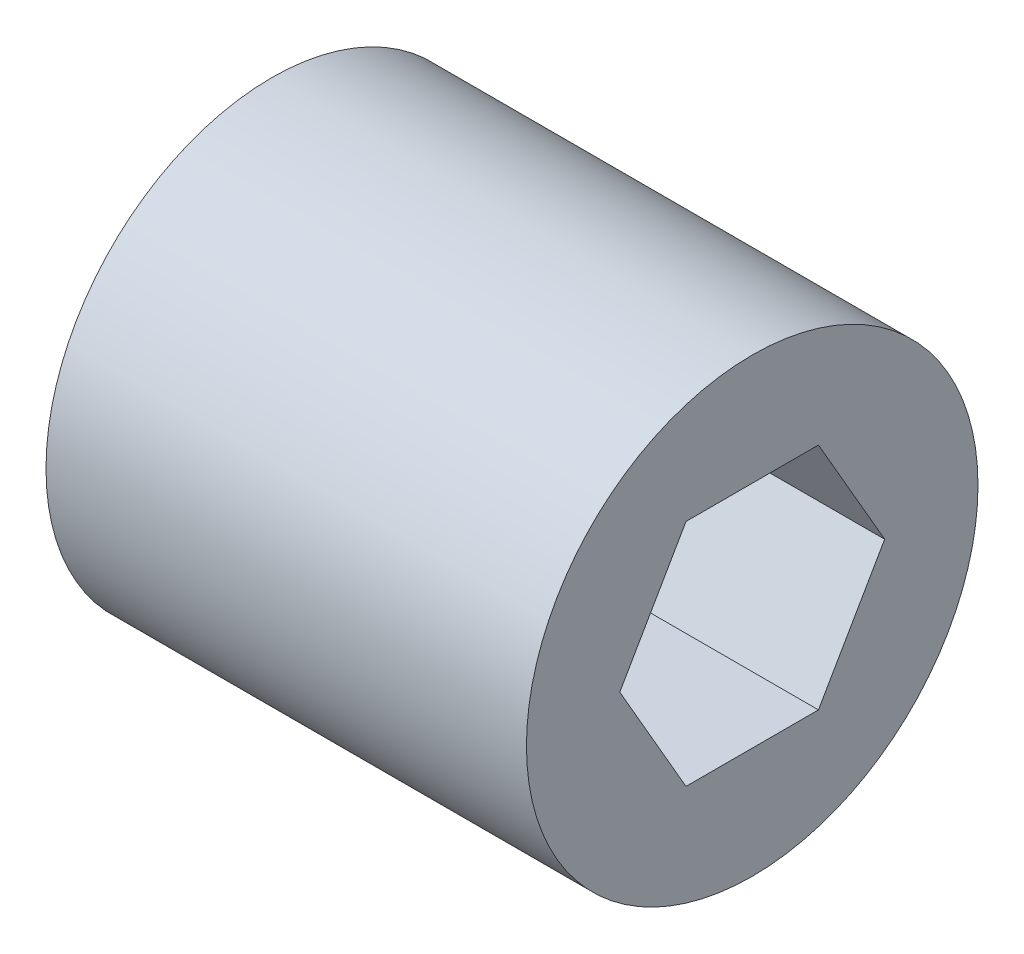
ISO-10303-21;
HEADER;
FILE_DESCRIPTION(('STEP AP214'),'2;1');
FILE_NAME('part.step','',(''),(''),'','','');
FILE_SCHEMA(('AUTOMOTIVE_DESIGN { 1 0 10303 214 1 1 1 1 }'));
ENDSEC;
DATA;
#1=APPLICATION_CONTEXT('core data for automotive mechanical design processes');
#2=APPLICATION_PROTOCOL_DEFINITION('international standard','automotive_design',2000,#1);
#3=PRODUCT_CONTEXT('',#1,'mechanical');
#4=PRODUCT('Part','Part','',(#3));
#5=PRODUCT_RELATED_PRODUCT_CATEGORY('part','',(#4));
#6=PRODUCT_DEFINITION_FORMATION('','',#4);
#7=PRODUCT_DEFINITION_CONTEXT('part definition',#1,'design');
#8=PRODUCT_DEFINITION('design','',#6,#7);
#9=PRODUCT_DEFINITION_SHAPE('','',#8);
#10=(LENGTH_UNIT() NAMED_UNIT(*) SI_UNIT(.MILLI.,.METRE.));
#11=(NAMED_UNIT(*) PLANE_ANGLE_UNIT() SI_UNIT($,.RADIAN.));
#12=(NAMED_UNIT(*) SI_UNIT($,.STERADIAN.) SOLID_ANGLE_UNIT());
#13=UNCERTAINTY_MEASURE_WITH_UNIT(LENGTH_MEASURE(1.E-05),#10,'distance_accuracy_value','');
#14=(GEOMETRIC_REPRESENTATION_CONTEXT(3) GLOBAL_UNCERTAINTY_ASSIGNED_CONTEXT((#13)) GLOBAL_UNIT_ASSIGNED_CONTEXT((#10,
#11,#12)) REPRESENTATION_CONTEXT('',''));
#15=CARTESIAN_POINT('',(0.,0.,0.));
#16=DIRECTION('',(0.,0.,1.));
#17=DIRECTION('',(1.,0.,0.));
#18=AXIS2_PLACEMENT_3D('',#15,#16,#17);
#19=CARTESIAN_POINT('',(26.6,0.,0.));
#20=DIRECTION('',(1.,0.,0.));
#21=DIRECTION('',(0.,0.,-1.));
#22=AXIS2_PLACEMENT_3D('',#19,#20,#21);
#23=PLANE('',#22);
#24=CARTESIAN_POINT('',(26.6,0.,0.));
#25=DIRECTION('',(1.,0.,0.));
#26=DIRECTION('',(0.,0.,-1.));
#27=AXIS2_PLACEMENT_3D('',#24,#25,#26);
#28=CIRCLE('',#27,12.5);
#29=CARTESIAN_POINT('',(26.6,0.,-12.5));
#30=VERTEX_POINT('',#29);
#31=EDGE_CURVE('E11',#30,#30,#28,.T.);
#32=ORIENTED_EDGE('',*,*,#31,.T.);
#33=EDGE_LOOP('',(#32));
#34=FACE_BOUND('',#33,.T.);
#35=DIRECTION('',(0.,0.866025403784438,0.500000000000001));
#36=VECTOR('',#35,1.);
#37=CARTESIAN_POINT('',(26.6,0.,-7.33234841870824));
#38=LINE('',#37,#36);
#39=CARTESIAN_POINT('',(26.6,0.,-7.33234841870824));
#40=VERTEX_POINT('',#39);
#41=CARTESIAN_POINT('',(26.6,6.35,-3.6661742093541));
#42=VERTEX_POINT('',#41);
#43=EDGE_CURVE('E102',#40,#42,#38,.T.);
#44=ORIENTED_EDGE('',*,*,#43,.F.);
#45=DIRECTION('',(0.,0.866025403784442,-0.499999999999995));
#46=VECTOR('',#45,1.);
#47=CARTESIAN_POINT('',(26.6,-6.34999999999995,-3.66617420935419));
#48=LINE('',#47,#46);
#49=CARTESIAN_POINT('',(26.6,-6.34999999999995,-3.66617420935419));
#50=VERTEX_POINT('',#49);
#51=EDGE_CURVE('E93',#50,#40,#48,.T.);
#52=ORIENTED_EDGE('',*,*,#51,.F.);
#53=DIRECTION('',(0.,0.,-1.));
#54=VECTOR('',#53,1.);
#55=CARTESIAN_POINT('',(26.6,-6.35000000000002,3.66617420935406));
#56=LINE('',#55,#54);
#57=CARTESIAN_POINT('',(26.6,-6.35000000000002,3.66617420935406));
#58=VERTEX_POINT('',#57);
#59=EDGE_CURVE('E127',#58,#50,#56,.T.);
#60=ORIENTED_EDGE('',*,*,#59,.F.);
#61=DIRECTION('',(0.,-0.866025403784435,-0.500000000000007));
#62=VECTOR('',#61,1.);
#63=CARTESIAN_POINT('',(26.6,0.,7.33234841870824));
#64=LINE('',#63,#62);
#65=CARTESIAN_POINT('',(26.6,0.,7.33234841870824));
#66=VERTEX_POINT('',#65);
#67=EDGE_CURVE('E124',#66,#58,#64,.T.);
#68=ORIENTED_EDGE('',*,*,#67,.F.);
#69=DIRECTION('',(0.,-0.866025403784442,0.499999999999995));
#70=VECTOR('',#69,1.);
#71=CARTESIAN_POINT('',(26.6,6.34999999999998,3.66617420935415));
#72=LINE('',#71,#70);
#73=CARTESIAN_POINT('',(26.6,6.34999999999998,3.66617420935415));
#74=VERTEX_POINT('',#73);
#75=EDGE_CURVE('E119',#74,#66,#72,.T.);
#76=ORIENTED_EDGE('',*,*,#75,.F.);
#77=DIRECTION('',(0.,0.,1.));
#78=VECTOR('',#77,1.);
#79=CARTESIAN_POINT('',(26.6,6.35,-3.6661742093541));
#80=LINE('',#79,#78);
#81=EDGE_CURVE('E115',#42,#74,#80,.T.);
#82=ORIENTED_EDGE('',*,*,#81,.F.);
#83=EDGE_LOOP('',(#44,#52,#60,#68,#76,#82));
#84=FACE_BOUND('',#83,.T.);
#85=ADVANCED_FACE('F39',(#34,#84),#23,.T.);
#86=CARTESIAN_POINT('',(0.,0.,0.));
#87=DIRECTION('',(1.,0.,0.));
#88=DIRECTION('',(0.,0.,-1.));
#89=AXIS2_PLACEMENT_3D('',#86,#87,#88);
#90=PLANE('',#89);
#91=CARTESIAN_POINT('',(0.,0.,0.));
#92=DIRECTION('',(1.,0.,0.));
#93=DIRECTION('',(0.,0.,-1.));
#94=AXIS2_PLACEMENT_3D('',#91,#92,#93);
#95=CIRCLE('',#94,12.5);
#96=CARTESIAN_POINT('',(0.,0.,-12.5));
#97=VERTEX_POINT('',#96);
#98=EDGE_CURVE('E43',#97,#97,#95,.T.);
#99=ORIENTED_EDGE('',*,*,#98,.F.);
#100=EDGE_LOOP('',(#99));
#101=FACE_BOUND('',#100,.T.);
#102=DIRECTION('',(0.,0.866025403784442,-0.499999999999995));
#103=VECTOR('',#102,1.);
#104=CARTESIAN_POINT('',(0.,-6.34999999999995,-3.66617420935419));
#105=LINE('',#104,#103);
#106=CARTESIAN_POINT('',(0.,-6.34999999999995,-3.66617420935419));
#107=VERTEX_POINT('',#106);
#108=CARTESIAN_POINT('',(0.,0.,-7.33234841870824));
#109=VERTEX_POINT('',#108);
#110=EDGE_CURVE('E63',#107,#109,#105,.T.);
#111=ORIENTED_EDGE('',*,*,#110,.T.);
#112=DIRECTION('',(0.,0.866025403784438,0.500000000000001));
#113=VECTOR('',#112,1.);
#114=CARTESIAN_POINT('',(0.,0.,-7.33234841870824));
#115=LINE('',#114,#113);
#116=CARTESIAN_POINT('',(0.,6.35,-3.6661742093541));
#117=VERTEX_POINT('',#116);
#118=EDGE_CURVE('E109',#109,#117,#115,.T.);
#119=ORIENTED_EDGE('',*,*,#118,.T.);
#120=DIRECTION('',(0.,0.,1.));
#121=VECTOR('',#120,1.);
#122=CARTESIAN_POINT('',(0.,6.35,-3.6661742093541));
#123=LINE('',#122,#121);
#124=CARTESIAN_POINT('',(0.,6.34999999999998,3.66617420935415));
#125=VERTEX_POINT('',#124);
#126=EDGE_CURVE('E134',#117,#125,#123,.T.);
#127=ORIENTED_EDGE('',*,*,#126,.T.);
#128=DIRECTION('',(0.,-0.866025403784442,0.499999999999995));
#129=VECTOR('',#128,1.);
#130=CARTESIAN_POINT('',(0.,6.34999999999998,3.66617420935415));
#131=LINE('',#130,#129);
#132=CARTESIAN_POINT('',(0.,0.,7.33234841870824));
#133=VERTEX_POINT('',#132);
#134=EDGE_CURVE('E138',#125,#133,#131,.T.);
#135=ORIENTED_EDGE('',*,*,#134,.T.);
#136=DIRECTION('',(0.,-0.866025403784435,-0.500000000000007));
#137=VECTOR('',#136,1.);
#138=CARTESIAN_POINT('',(0.,0.,7.33234841870824));
#139=LINE('',#138,#137);
#140=CARTESIAN_POINT('',(0.,-6.35000000000002,3.66617420935406));
#141=VERTEX_POINT('',#140);
#142=EDGE_CURVE('E142',#133,#141,#139,.T.);
#143=ORIENTED_EDGE('',*,*,#142,.T.);
#144=DIRECTION('',(0.,0.,-1.));
#145=VECTOR('',#144,1.);
#146=CARTESIAN_POINT('',(0.,-6.35000000000002,3.66617420935406));
#147=LINE('',#146,#145);
#148=EDGE_CURVE('E103',#141,#107,#147,.T.);
#149=ORIENTED_EDGE('',*,*,#148,.T.);
#150=EDGE_LOOP('',(#111,#119,#127,#135,#143,#149));
#151=FACE_BOUND('',#150,.T.);
#152=ADVANCED_FACE('F166',(#101,#151),#90,.F.);
#153=CARTESIAN_POINT('',(26.6,0.,0.));
#154=DIRECTION('',(-1.,0.,0.));
#155=DIRECTION('',(0.,0.,1.));
#156=AXIS2_PLACEMENT_3D('',#153,#154,#155);
#157=CYLINDRICAL_SURFACE('',#156,12.5);
#158=ORIENTED_EDGE('',*,*,#31,.F.);
#159=EDGE_LOOP('',(#158));
#160=FACE_BOUND('',#159,.T.);
#161=ORIENTED_EDGE('',*,*,#98,.T.);
#162=EDGE_LOOP('',(#161));
#163=FACE_BOUND('',#162,.T.);
#164=ADVANCED_FACE('F41',(#160,#163),#157,.T.);
#165=CARTESIAN_POINT('',(26.6,-6.34999999999995,-3.66617420935419));
#166=DIRECTION('',(0.,0.499999999999995,0.866025403784442));
#167=DIRECTION('',(0.,-0.866025403784442,0.499999999999995));
#168=AXIS2_PLACEMENT_3D('',#165,#166,#167);
#169=PLANE('',#168);
#170=ORIENTED_EDGE('',*,*,#110,.F.);
#171=DIRECTION('',(-1.,0.,0.));
#172=VECTOR('',#171,1.);
#173=CARTESIAN_POINT('',(26.6,-6.34999999999995,-3.66617420935419));
#174=LINE('',#173,#172);
#175=EDGE_CURVE('E97',#50,#107,#174,.T.);
#176=ORIENTED_EDGE('',*,*,#175,.F.);
#177=ORIENTED_EDGE('',*,*,#51,.T.);
#178=DIRECTION('',(-1.,0.,0.));
#179=VECTOR('',#178,1.);
#180=CARTESIAN_POINT('',(26.6,0.,-7.33234841870824));
#181=LINE('',#180,#179);
#182=EDGE_CURVE('E96',#40,#109,#181,.T.);
#183=ORIENTED_EDGE('',*,*,#182,.T.);
#184=EDGE_LOOP('',(#170,#176,#177,#183));
#185=FACE_BOUND('',#184,.T.);
#186=ADVANCED_FACE('F95',(#185),#169,.T.);
#187=CARTESIAN_POINT('',(26.6,0.,-7.33234841870824));
#188=DIRECTION('',(0.,-0.500000000000001,0.866025403784438));
#189=DIRECTION('',(0.,-0.866025403784438,-0.500000000000001));
#190=AXIS2_PLACEMENT_3D('',#187,#188,#189);
#191=PLANE('',#190);
#192=ORIENTED_EDGE('',*,*,#118,.F.);
#193=ORIENTED_EDGE('',*,*,#182,.F.);
#194=ORIENTED_EDGE('',*,*,#43,.T.);
#195=DIRECTION('',(-1.,0.,0.));
#196=VECTOR('',#195,1.);
#197=CARTESIAN_POINT('',(26.6,6.35,-3.6661742093541));
#198=LINE('',#197,#196);
#199=EDGE_CURVE('E111',#42,#117,#198,.T.);
#200=ORIENTED_EDGE('',*,*,#199,.T.);
#201=EDGE_LOOP('',(#192,#193,#194,#200));
#202=FACE_BOUND('',#201,.T.);
#203=ADVANCED_FACE('F106',(#202),#191,.T.);
#204=CARTESIAN_POINT('',(26.6,6.35,-3.6661742093541));
#205=DIRECTION('',(0.,-1.,0.));
#206=DIRECTION('',(0.,0.,-1.));
#207=AXIS2_PLACEMENT_3D('',#204,#205,#206);
#208=PLANE('',#207);
#209=ORIENTED_EDGE('',*,*,#126,.F.);
#210=ORIENTED_EDGE('',*,*,#199,.F.);
#211=ORIENTED_EDGE('',*,*,#81,.T.);
#212=DIRECTION('',(-1.,0.,0.));
#213=VECTOR('',#212,1.);
#214=CARTESIAN_POINT('',(26.6,6.34999999999998,3.66617420935415));
#215=LINE('',#214,#213);
#216=EDGE_CURVE('E156',#74,#125,#215,.T.);
#217=ORIENTED_EDGE('',*,*,#216,.T.);
#218=EDGE_LOOP('',(#209,#210,#211,#217));
#219=FACE_BOUND('',#218,.T.);
#220=ADVANCED_FACE('F162',(#219),#208,.T.);
#221=CARTESIAN_POINT('',(26.6,6.34999999999998,3.66617420935415));
#222=DIRECTION('',(0.,-0.499999999999995,-0.866025403784442));
#223=DIRECTION('',(0.,0.866025403784442,-0.499999999999995));
#224=AXIS2_PLACEMENT_3D('',#221,#222,#223);
#225=PLANE('',#224);
#226=ORIENTED_EDGE('',*,*,#134,.F.);
#227=ORIENTED_EDGE('',*,*,#216,.F.);
#228=ORIENTED_EDGE('',*,*,#75,.T.);
#229=DIRECTION('',(-1.,0.,0.));
#230=VECTOR('',#229,1.);
#231=CARTESIAN_POINT('',(26.6,0.,7.33234841870824));
#232=LINE('',#231,#230);
#233=EDGE_CURVE('E153',#66,#133,#232,.T.);
#234=ORIENTED_EDGE('',*,*,#233,.T.);
#235=EDGE_LOOP('',(#226,#227,#228,#234));
#236=FACE_BOUND('',#235,.T.);
#237=ADVANCED_FACE('F174',(#236),#225,.T.);
#238=CARTESIAN_POINT('',(26.6,0.,7.33234841870824));
#239=DIRECTION('',(0.,0.500000000000007,-0.866025403784434));
#240=DIRECTION('',(0.,0.866025403784435,0.500000000000007));
#241=AXIS2_PLACEMENT_3D('',#238,#239,#240);
#242=PLANE('',#241);
#243=ORIENTED_EDGE('',*,*,#142,.F.);
#244=ORIENTED_EDGE('',*,*,#233,.F.);
#245=ORIENTED_EDGE('',*,*,#67,.T.);
#246=DIRECTION('',(-1.,0.,0.));
#247=VECTOR('',#246,1.);
#248=CARTESIAN_POINT('',(26.6,-6.35000000000002,3.66617420935406));
#249=LINE('',#248,#247);
#250=EDGE_CURVE('E55',#58,#141,#249,.T.);
#251=ORIENTED_EDGE('',*,*,#250,.T.);
#252=EDGE_LOOP('',(#243,#244,#245,#251));
#253=FACE_BOUND('',#252,.T.);
#254=ADVANCED_FACE('F172',(#253),#242,.T.);
#255=CARTESIAN_POINT('',(26.6,-6.35000000000002,3.66617420935406));
#256=DIRECTION('',(0.,1.,0.));
#257=DIRECTION('',(0.,0.,1.));
#258=AXIS2_PLACEMENT_3D('',#255,#256,#257);
#259=PLANE('',#258);
#260=ORIENTED_EDGE('',*,*,#148,.F.);
#261=ORIENTED_EDGE('',*,*,#250,.F.);
#262=ORIENTED_EDGE('',*,*,#59,.T.);
#263=ORIENTED_EDGE('',*,*,#175,.T.);
#264=EDGE_LOOP('',(#260,#261,#262,#263));
#265=FACE_BOUND('',#264,.T.);
#266=ADVANCED_FACE('F168',(#265),#259,.T.);
#267=CLOSED_SHELL('',(#85,#152,#164,#186,#203,#220,#237,#254,#266));
#268=MANIFOLD_SOLID_BREP('B2',#267);
#269=ADVANCED_BREP_SHAPE_REPRESENTATION('',(#18,#268),#14);
#270=SHAPE_DEFINITION_REPRESENTATION(#9,#269);
ENDSEC;
END-ISO-10303-21;
